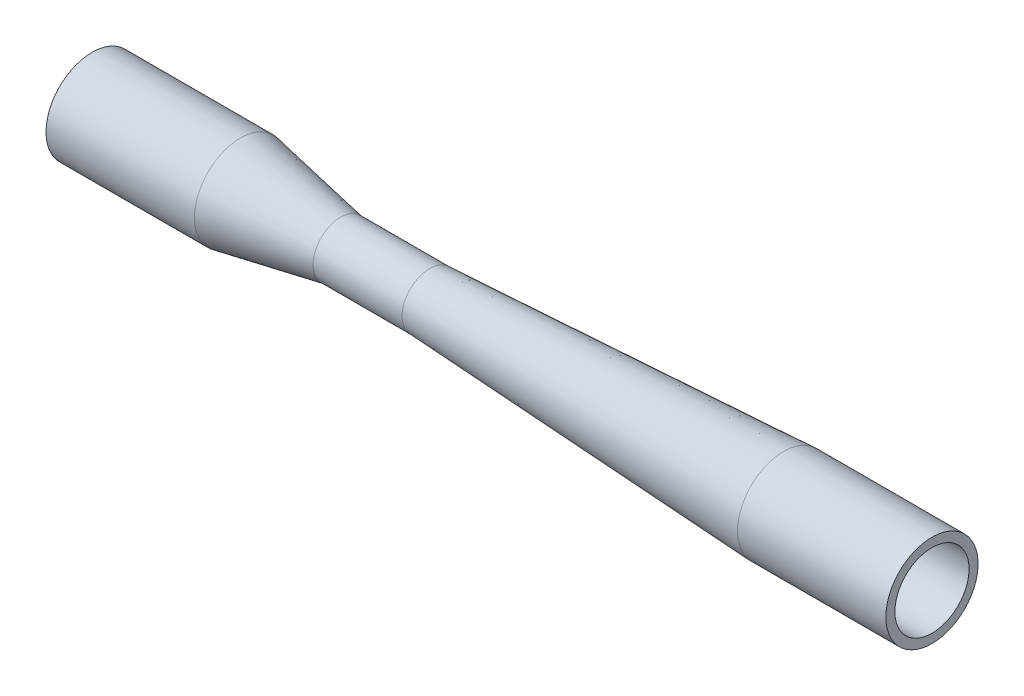
ISO-10303-21;
HEADER;
FILE_DESCRIPTION(('STEP AP214'),'2;1');
FILE_NAME('part.step','',(''),(''),'','','');
FILE_SCHEMA(('AUTOMOTIVE_DESIGN { 1 0 10303 214 1 1 1 1 }'));
ENDSEC;
DATA;
#1=APPLICATION_CONTEXT('core data for automotive mechanical design processes');
#2=APPLICATION_PROTOCOL_DEFINITION('international standard','automotive_design',2000,#1);
#3=PRODUCT_CONTEXT('',#1,'mechanical');
#4=PRODUCT('Part','Part','',(#3));
#5=PRODUCT_RELATED_PRODUCT_CATEGORY('part','',(#4));
#6=PRODUCT_DEFINITION_FORMATION('','',#4);
#7=PRODUCT_DEFINITION_CONTEXT('part definition',#1,'design');
#8=PRODUCT_DEFINITION('design','',#6,#7);
#9=PRODUCT_DEFINITION_SHAPE('','',#8);
#10=(LENGTH_UNIT() NAMED_UNIT(*) SI_UNIT(.MILLI.,.METRE.));
#11=(NAMED_UNIT(*) PLANE_ANGLE_UNIT() SI_UNIT($,.RADIAN.));
#12=(NAMED_UNIT(*) SI_UNIT($,.STERADIAN.) SOLID_ANGLE_UNIT());
#13=UNCERTAINTY_MEASURE_WITH_UNIT(LENGTH_MEASURE(1.E-05),#10,'distance_accuracy_value','');
#14=(GEOMETRIC_REPRESENTATION_CONTEXT(3) GLOBAL_UNCERTAINTY_ASSIGNED_CONTEXT((#13)) GLOBAL_UNIT_ASSIGNED_CONTEXT((#10,
#11,#12)) REPRESENTATION_CONTEXT('',''));
#15=CARTESIAN_POINT('',(0.,0.,0.));
#16=DIRECTION('',(0.,0.,1.));
#17=DIRECTION('',(1.,0.,0.));
#18=AXIS2_PLACEMENT_3D('',#15,#16,#17);
#19=CARTESIAN_POINT('',(0.,12.5,0.));
#20=DIRECTION('',(1.,0.,0.));
#21=DIRECTION('',(0.,0.,-1.));
#22=AXIS2_PLACEMENT_3D('',#19,#20,#21);
#23=PLANE('',#22);
#24=CARTESIAN_POINT('',(0.,0.,0.));
#25=DIRECTION('',(-1.,0.,0.));
#26=DIRECTION('',(0.,0.,1.));
#27=AXIS2_PLACEMENT_3D('',#24,#25,#26);
#28=CIRCLE('',#27,12.5);
#29=CARTESIAN_POINT('',(0.,0.,12.5));
#30=VERTEX_POINT('',#29);
#31=EDGE_CURVE('E96',#30,#30,#28,.T.);
#32=ORIENTED_EDGE('',*,*,#31,.F.);
#33=EDGE_LOOP('',(#32));
#34=FACE_BOUND('',#33,.T.);
#35=CARTESIAN_POINT('',(0.,0.,0.));
#36=DIRECTION('',(-1.,0.,0.));
#37=DIRECTION('',(0.,0.,1.));
#38=AXIS2_PLACEMENT_3D('',#35,#36,#37);
#39=CIRCLE('',#38,15.5356468239474);
#40=CARTESIAN_POINT('',(0.,0.,15.5356468239474));
#41=VERTEX_POINT('',#40);
#42=EDGE_CURVE('E10',#41,#41,#39,.T.);
#43=ORIENTED_EDGE('',*,*,#42,.T.);
#44=EDGE_LOOP('',(#43));
#45=FACE_BOUND('',#44,.T.);
#46=ADVANCED_FACE('F45',(#34,#45),#23,.F.);
#47=CARTESIAN_POINT('',(-187.472436386027,0.,0.));
#48=DIRECTION('',(-1.,0.,0.));
#49=DIRECTION('',(0.,0.,1.));
#50=AXIS2_PLACEMENT_3D('',#47,#48,#49);
#51=CYLINDRICAL_SURFACE('',#50,15.5356468239474);
#52=ORIENTED_EDGE('',*,*,#42,.F.);
#53=EDGE_LOOP('',(#52));
#54=FACE_BOUND('',#53,.T.);
#55=CARTESIAN_POINT('',(50.,0.,0.));
#56=DIRECTION('',(-1.,0.,0.));
#57=DIRECTION('',(0.,0.,1.));
#58=AXIS2_PLACEMENT_3D('',#55,#56,#57);
#59=CIRCLE('',#58,15.5356468239474);
#60=CARTESIAN_POINT('',(50.,0.,15.5356468239474));
#61=VERTEX_POINT('',#60);
#62=EDGE_CURVE('E52',#61,#61,#59,.T.);
#63=ORIENTED_EDGE('',*,*,#62,.T.);
#64=EDGE_LOOP('',(#63));
#65=FACE_BOUND('',#64,.T.);
#66=ADVANCED_FACE('F104',(#54,#65),#51,.T.);
#67=CARTESIAN_POINT('',(83.7219823394945,0.,0.));
#68=DIRECTION('',(-1.,0.,0.));
#69=DIRECTION('',(0.,0.,1.));
#70=AXIS2_PLACEMENT_3D('',#67,#68,#69);
#71=CONICAL_SURFACE('',#70,9.28564682394744,0.183259571459405);
#72=ORIENTED_EDGE('',*,*,#62,.F.);
#73=EDGE_LOOP('',(#72));
#74=FACE_BOUND('',#73,.T.);
#75=CARTESIAN_POINT('',(83.7219823394945,0.,0.));
#76=DIRECTION('',(-1.,0.,0.));
#77=DIRECTION('',(0.,0.,1.));
#78=AXIS2_PLACEMENT_3D('',#75,#76,#77);
#79=CIRCLE('',#78,9.28564682394744);
#80=CARTESIAN_POINT('',(83.7219823394945,0.,9.28564682394744));
#81=VERTEX_POINT('',#80);
#82=EDGE_CURVE('E57',#81,#81,#79,.T.);
#83=ORIENTED_EDGE('',*,*,#82,.T.);
#84=EDGE_LOOP('',(#83));
#85=FACE_BOUND('',#84,.T.);
#86=ADVANCED_FACE('F108',(#74,#85),#71,.T.);
#87=CARTESIAN_POINT('',(-187.472436386027,0.,0.));
#88=DIRECTION('',(-1.,0.,0.));
#89=DIRECTION('',(0.,0.,1.));
#90=AXIS2_PLACEMENT_3D('',#87,#88,#89);
#91=CYLINDRICAL_SURFACE('',#90,9.28564682394744);
#92=ORIENTED_EDGE('',*,*,#82,.F.);
#93=EDGE_LOOP('',(#92));
#94=FACE_BOUND('',#93,.T.);
#95=CARTESIAN_POINT('',(113.721982339495,0.,0.));
#96=DIRECTION('',(-1.,0.,0.));
#97=DIRECTION('',(0.,0.,1.));
#98=AXIS2_PLACEMENT_3D('',#95,#96,#97);
#99=CIRCLE('',#98,9.28564682394744);
#100=CARTESIAN_POINT('',(113.721982339495,0.,9.28564682394744));
#101=VERTEX_POINT('',#100);
#102=EDGE_CURVE('E62',#101,#101,#99,.T.);
#103=ORIENTED_EDGE('',*,*,#102,.T.);
#104=EDGE_LOOP('',(#103));
#105=FACE_BOUND('',#104,.T.);
#106=ADVANCED_FACE('F113',(#94,#105),#91,.T.);
#107=CARTESIAN_POINT('',(232.979086637795,0.,0.));
#108=DIRECTION('',(1.,0.,0.));
#109=DIRECTION('',(0.,0.,-1.));
#110=AXIS2_PLACEMENT_3D('',#107,#108,#109);
#111=CONICAL_SURFACE('',#110,15.5356468239474,0.0523598775598305);
#112=ORIENTED_EDGE('',*,*,#102,.F.);
#113=EDGE_LOOP('',(#112));
#114=FACE_BOUND('',#113,.T.);
#115=CARTESIAN_POINT('',(232.979086637795,0.,0.));
#116=DIRECTION('',(-1.,0.,0.));
#117=DIRECTION('',(0.,0.,1.));
#118=AXIS2_PLACEMENT_3D('',#115,#116,#117);
#119=CIRCLE('',#118,15.5356468239474);
#120=CARTESIAN_POINT('',(232.979086637795,0.,15.5356468239474));
#121=VERTEX_POINT('',#120);
#122=EDGE_CURVE('E68',#121,#121,#119,.T.);
#123=ORIENTED_EDGE('',*,*,#122,.T.);
#124=EDGE_LOOP('',(#123));
#125=FACE_BOUND('',#124,.T.);
#126=ADVANCED_FACE('F119',(#114,#125),#111,.T.);
#127=CARTESIAN_POINT('',(-187.472436386027,0.,0.));
#128=DIRECTION('',(-1.,0.,0.));
#129=DIRECTION('',(0.,0.,1.));
#130=AXIS2_PLACEMENT_3D('',#127,#128,#129);
#131=CYLINDRICAL_SURFACE('',#130,15.5356468239474);
#132=ORIENTED_EDGE('',*,*,#122,.F.);
#133=EDGE_LOOP('',(#132));
#134=FACE_BOUND('',#133,.T.);
#135=CARTESIAN_POINT('',(282.979086637795,0.,0.));
#136=DIRECTION('',(-1.,0.,0.));
#137=DIRECTION('',(0.,0.,1.));
#138=AXIS2_PLACEMENT_3D('',#135,#136,#137);
#139=CIRCLE('',#138,15.5356468239474);
#140=CARTESIAN_POINT('',(282.979086637795,0.,15.5356468239474));
#141=VERTEX_POINT('',#140);
#142=EDGE_CURVE('E72',#141,#141,#139,.T.);
#143=ORIENTED_EDGE('',*,*,#142,.T.);
#144=EDGE_LOOP('',(#143));
#145=FACE_BOUND('',#144,.T.);
#146=ADVANCED_FACE('F123',(#134,#145),#131,.T.);
#147=CARTESIAN_POINT('',(282.979086637795,15.5356468239474,0.));
#148=DIRECTION('',(-1.,0.,0.));
#149=DIRECTION('',(0.,0.,1.));
#150=AXIS2_PLACEMENT_3D('',#147,#148,#149);
#151=PLANE('',#150);
#152=ORIENTED_EDGE('',*,*,#142,.F.);
#153=EDGE_LOOP('',(#152));
#154=FACE_BOUND('',#153,.T.);
#155=CARTESIAN_POINT('',(282.979086637795,0.,0.));
#156=DIRECTION('',(-1.,0.,0.));
#157=DIRECTION('',(0.,0.,1.));
#158=AXIS2_PLACEMENT_3D('',#155,#156,#157);
#159=CIRCLE('',#158,12.5);
#160=CARTESIAN_POINT('',(282.979086637795,0.,12.5));
#161=VERTEX_POINT('',#160);
#162=EDGE_CURVE('E76',#161,#161,#159,.T.);
#163=ORIENTED_EDGE('',*,*,#162,.T.);
#164=EDGE_LOOP('',(#163));
#165=FACE_BOUND('',#164,.T.);
#166=ADVANCED_FACE('F127',(#154,#165),#151,.F.);
#167=CARTESIAN_POINT('',(-187.472436386027,0.,0.));
#168=DIRECTION('',(-1.,0.,0.));
#169=DIRECTION('',(0.,0.,1.));
#170=AXIS2_PLACEMENT_3D('',#167,#168,#169);
#171=CYLINDRICAL_SURFACE('',#170,12.5);
#172=ORIENTED_EDGE('',*,*,#162,.F.);
#173=EDGE_LOOP('',(#172));
#174=FACE_BOUND('',#173,.T.);
#175=CARTESIAN_POINT('',(232.979086637795,0.,0.));
#176=DIRECTION('',(-1.,0.,0.));
#177=DIRECTION('',(0.,0.,1.));
#178=AXIS2_PLACEMENT_3D('',#175,#176,#177);
#179=CIRCLE('',#178,12.5);
#180=CARTESIAN_POINT('',(232.979086637795,0.,12.5));
#181=VERTEX_POINT('',#180);
#182=EDGE_CURVE('E80',#181,#181,#179,.T.);
#183=ORIENTED_EDGE('',*,*,#182,.T.);
#184=EDGE_LOOP('',(#183));
#185=FACE_BOUND('',#184,.T.);
#186=ADVANCED_FACE('F131',(#174,#185),#171,.F.);
#187=CARTESIAN_POINT('',(113.721982339495,0.,0.));
#188=DIRECTION('',(1.,0.,0.));
#189=DIRECTION('',(0.,0.,-1.));
#190=AXIS2_PLACEMENT_3D('',#187,#188,#189);
#191=CONICAL_SURFACE('',#190,6.25,0.0523598775598305);
#192=ORIENTED_EDGE('',*,*,#182,.F.);
#193=EDGE_LOOP('',(#192));
#194=FACE_BOUND('',#193,.T.);
#195=CARTESIAN_POINT('',(113.721982339495,0.,0.));
#196=DIRECTION('',(-1.,0.,0.));
#197=DIRECTION('',(0.,0.,1.));
#198=AXIS2_PLACEMENT_3D('',#195,#196,#197);
#199=CIRCLE('',#198,6.25);
#200=CARTESIAN_POINT('',(113.721982339495,0.,6.25));
#201=VERTEX_POINT('',#200);
#202=EDGE_CURVE('E84',#201,#201,#199,.T.);
#203=ORIENTED_EDGE('',*,*,#202,.T.);
#204=EDGE_LOOP('',(#203));
#205=FACE_BOUND('',#204,.T.);
#206=ADVANCED_FACE('F135',(#194,#205),#191,.F.);
#207=CARTESIAN_POINT('',(-187.472436386027,0.,0.));
#208=DIRECTION('',(-1.,0.,0.));
#209=DIRECTION('',(0.,0.,1.));
#210=AXIS2_PLACEMENT_3D('',#207,#208,#209);
#211=CYLINDRICAL_SURFACE('',#210,6.25);
#212=ORIENTED_EDGE('',*,*,#202,.F.);
#213=EDGE_LOOP('',(#212));
#214=FACE_BOUND('',#213,.T.);
#215=CARTESIAN_POINT('',(83.7219823394945,0.,0.));
#216=DIRECTION('',(-1.,0.,0.));
#217=DIRECTION('',(0.,0.,1.));
#218=AXIS2_PLACEMENT_3D('',#215,#216,#217);
#219=CIRCLE('',#218,6.25);
#220=CARTESIAN_POINT('',(83.7219823394945,0.,6.25));
#221=VERTEX_POINT('',#220);
#222=EDGE_CURVE('E88',#221,#221,#219,.T.);
#223=ORIENTED_EDGE('',*,*,#222,.T.);
#224=EDGE_LOOP('',(#223));
#225=FACE_BOUND('',#224,.T.);
#226=ADVANCED_FACE('F139',(#214,#225),#211,.F.);
#227=CARTESIAN_POINT('',(50.,0.,0.));
#228=DIRECTION('',(-1.,0.,0.));
#229=DIRECTION('',(0.,0.,1.));
#230=AXIS2_PLACEMENT_3D('',#227,#228,#229);
#231=CONICAL_SURFACE('',#230,12.5,0.183259571459405);
#232=ORIENTED_EDGE('',*,*,#222,.F.);
#233=EDGE_LOOP('',(#232));
#234=FACE_BOUND('',#233,.T.);
#235=CARTESIAN_POINT('',(50.,0.,0.));
#236=DIRECTION('',(-1.,0.,0.));
#237=DIRECTION('',(0.,0.,1.));
#238=AXIS2_PLACEMENT_3D('',#235,#236,#237);
#239=CIRCLE('',#238,12.5);
#240=CARTESIAN_POINT('',(50.,0.,12.5));
#241=VERTEX_POINT('',#240);
#242=EDGE_CURVE('E92',#241,#241,#239,.T.);
#243=ORIENTED_EDGE('',*,*,#242,.T.);
#244=EDGE_LOOP('',(#243));
#245=FACE_BOUND('',#244,.T.);
#246=ADVANCED_FACE('F143',(#234,#245),#231,.F.);
#247=CARTESIAN_POINT('',(-187.472436386027,0.,0.));
#248=DIRECTION('',(-1.,0.,0.));
#249=DIRECTION('',(0.,0.,1.));
#250=AXIS2_PLACEMENT_3D('',#247,#248,#249);
#251=CYLINDRICAL_SURFACE('',#250,12.5);
#252=ORIENTED_EDGE('',*,*,#242,.F.);
#253=EDGE_LOOP('',(#252));
#254=FACE_BOUND('',#253,.T.);
#255=ORIENTED_EDGE('',*,*,#31,.T.);
#256=EDGE_LOOP('',(#255));
#257=FACE_BOUND('',#256,.T.);
#258=ADVANCED_FACE('F101',(#254,#257),#251,.F.);
#259=CLOSED_SHELL('',(#46,#66,#86,#106,#126,#146,#166,#186,#206,#226,#246,#258));
#260=MANIFOLD_SOLID_BREP('B2',#259);
#261=ADVANCED_BREP_SHAPE_REPRESENTATION('',(#18,#260),#14);
#262=SHAPE_DEFINITION_REPRESENTATION(#9,#261);
ENDSEC;
END-ISO-10303-21;
